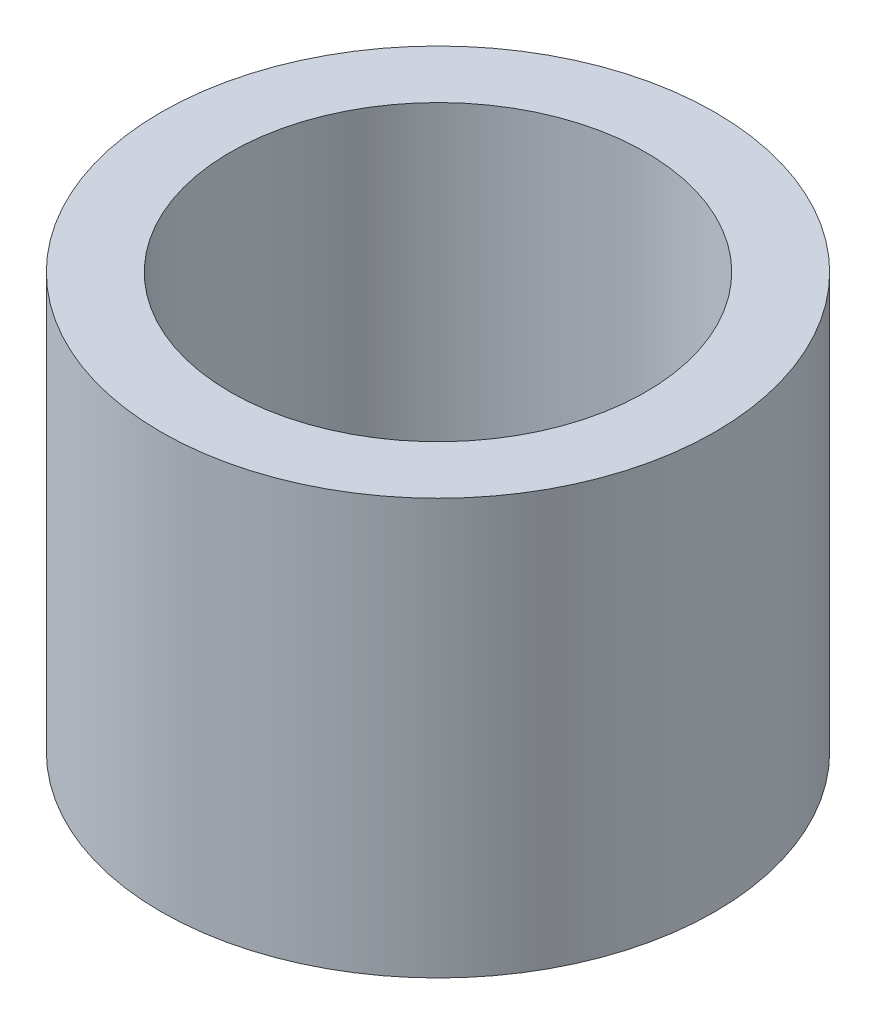
ISO-10303-21;
HEADER;
FILE_DESCRIPTION(('STEP AP214'),'2;1');
FILE_NAME('part.step','',(''),(''),'','','');
FILE_SCHEMA(('AUTOMOTIVE_DESIGN { 1 0 10303 214 1 1 1 1 }'));
ENDSEC;
DATA;
#1=APPLICATION_CONTEXT('core data for automotive mechanical design processes');
#2=APPLICATION_PROTOCOL_DEFINITION('international standard','automotive_design',2000,#1);
#3=PRODUCT_CONTEXT('',#1,'mechanical');
#4=PRODUCT('Part','Part','',(#3));
#5=PRODUCT_RELATED_PRODUCT_CATEGORY('part','',(#4));
#6=PRODUCT_DEFINITION_FORMATION('','',#4);
#7=PRODUCT_DEFINITION_CONTEXT('part definition',#1,'design');
#8=PRODUCT_DEFINITION('design','',#6,#7);
#9=PRODUCT_DEFINITION_SHAPE('','',#8);
#10=(LENGTH_UNIT() NAMED_UNIT(*) SI_UNIT(.MILLI.,.METRE.));
#11=(NAMED_UNIT(*) PLANE_ANGLE_UNIT() SI_UNIT($,.RADIAN.));
#12=(NAMED_UNIT(*) SI_UNIT($,.STERADIAN.) SOLID_ANGLE_UNIT());
#13=UNCERTAINTY_MEASURE_WITH_UNIT(LENGTH_MEASURE(1.E-05),#10,'distance_accuracy_value','');
#14=(GEOMETRIC_REPRESENTATION_CONTEXT(3) GLOBAL_UNCERTAINTY_ASSIGNED_CONTEXT((#13)) GLOBAL_UNIT_ASSIGNED_CONTEXT((#10,
#11,#12)) REPRESENTATION_CONTEXT('',''));
#15=CARTESIAN_POINT('',(0.,0.,0.));
#16=DIRECTION('',(0.,0.,1.));
#17=DIRECTION('',(1.,0.,0.));
#18=AXIS2_PLACEMENT_3D('',#15,#16,#17);
#19=CARTESIAN_POINT('',(0.,15.,0.));
#20=DIRECTION('',(0.,1.,0.));
#21=DIRECTION('',(0.,0.,1.));
#22=AXIS2_PLACEMENT_3D('',#19,#20,#21);
#23=PLANE('',#22);
#24=CARTESIAN_POINT('',(0.,15.,0.));
#25=DIRECTION('',(0.,1.,0.));
#26=DIRECTION('',(0.,0.,1.));
#27=AXIS2_PLACEMENT_3D('',#24,#25,#26);
#28=CIRCLE('',#27,10.);
#29=CARTESIAN_POINT('',(0.,15.,10.));
#30=VERTEX_POINT('',#29);
#31=EDGE_CURVE('E10',#30,#30,#28,.T.);
#32=ORIENTED_EDGE('',*,*,#31,.T.);
#33=EDGE_LOOP('',(#32));
#34=FACE_BOUND('',#33,.T.);
#35=CARTESIAN_POINT('',(0.,15.,0.));
#36=DIRECTION('',(0.,1.,0.));
#37=DIRECTION('',(0.,0.,1.));
#38=AXIS2_PLACEMENT_3D('',#35,#36,#37);
#39=CIRCLE('',#38,7.5);
#40=CARTESIAN_POINT('',(0.,15.,7.5));
#41=VERTEX_POINT('',#40);
#42=EDGE_CURVE('E43',#41,#41,#39,.T.);
#43=ORIENTED_EDGE('',*,*,#42,.F.);
#44=EDGE_LOOP('',(#43));
#45=FACE_BOUND('',#44,.T.);
#46=ADVANCED_FACE('F32',(#34,#45),#23,.T.);
#47=CARTESIAN_POINT('',(0.,0.,0.));
#48=DIRECTION('',(0.,1.,0.));
#49=DIRECTION('',(0.,0.,1.));
#50=AXIS2_PLACEMENT_3D('',#47,#48,#49);
#51=PLANE('',#50);
#52=CARTESIAN_POINT('',(0.,0.,0.));
#53=DIRECTION('',(0.,1.,0.));
#54=DIRECTION('',(0.,0.,1.));
#55=AXIS2_PLACEMENT_3D('',#52,#53,#54);
#56=CIRCLE('',#55,10.);
#57=CARTESIAN_POINT('',(0.,0.,10.));
#58=VERTEX_POINT('',#57);
#59=EDGE_CURVE('E36',#58,#58,#56,.T.);
#60=ORIENTED_EDGE('',*,*,#59,.F.);
#61=EDGE_LOOP('',(#60));
#62=FACE_BOUND('',#61,.T.);
#63=CARTESIAN_POINT('',(0.,0.,0.));
#64=DIRECTION('',(0.,1.,0.));
#65=DIRECTION('',(0.,0.,1.));
#66=AXIS2_PLACEMENT_3D('',#63,#64,#65);
#67=CIRCLE('',#66,7.5);
#68=CARTESIAN_POINT('',(0.,0.,7.5));
#69=VERTEX_POINT('',#68);
#70=EDGE_CURVE('E45',#69,#69,#67,.T.);
#71=ORIENTED_EDGE('',*,*,#70,.T.);
#72=EDGE_LOOP('',(#71));
#73=FACE_BOUND('',#72,.T.);
#74=ADVANCED_FACE('F55',(#62,#73),#51,.F.);
#75=CARTESIAN_POINT('',(0.,15.,0.));
#76=DIRECTION('',(0.,-1.,0.));
#77=DIRECTION('',(0.,0.,-1.));
#78=AXIS2_PLACEMENT_3D('',#75,#76,#77);
#79=CYLINDRICAL_SURFACE('',#78,10.);
#80=ORIENTED_EDGE('',*,*,#31,.F.);
#81=EDGE_LOOP('',(#80));
#82=FACE_BOUND('',#81,.T.);
#83=ORIENTED_EDGE('',*,*,#59,.T.);
#84=EDGE_LOOP('',(#83));
#85=FACE_BOUND('',#84,.T.);
#86=ADVANCED_FACE('F34',(#82,#85),#79,.T.);
#87=CARTESIAN_POINT('',(0.,15.,0.));
#88=DIRECTION('',(0.,-1.,0.));
#89=DIRECTION('',(0.,0.,-1.));
#90=AXIS2_PLACEMENT_3D('',#87,#88,#89);
#91=CYLINDRICAL_SURFACE('',#90,7.5);
#92=ORIENTED_EDGE('',*,*,#42,.T.);
#93=EDGE_LOOP('',(#92));
#94=FACE_BOUND('',#93,.T.);
#95=ORIENTED_EDGE('',*,*,#70,.F.);
#96=EDGE_LOOP('',(#95));
#97=FACE_BOUND('',#96,.T.);
#98=ADVANCED_FACE('F51',(#94,#97),#91,.F.);
#99=CLOSED_SHELL('',(#46,#74,#86,#98));
#100=MANIFOLD_SOLID_BREP('B2',#99);
#101=ADVANCED_BREP_SHAPE_REPRESENTATION('',(#18,#100),#14);
#102=SHAPE_DEFINITION_REPRESENTATION(#9,#101);
ENDSEC;
END-ISO-10303-21;
